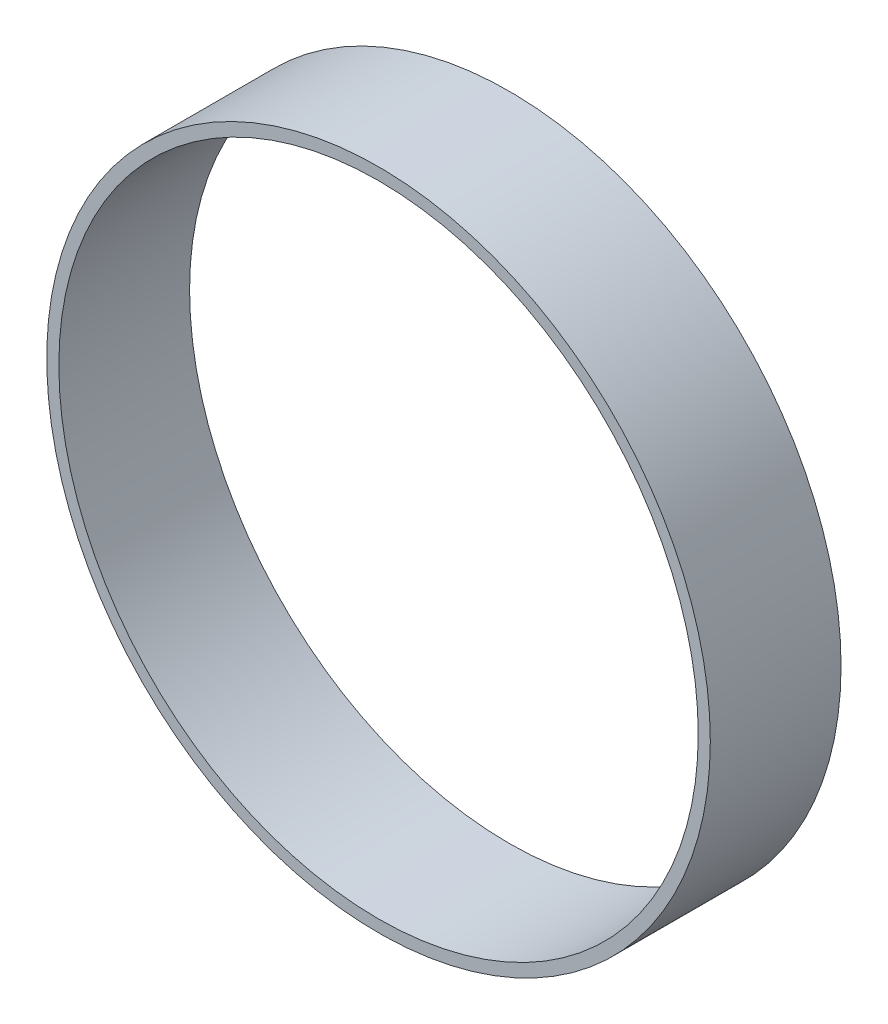
ISO-10303-21;
HEADER;
FILE_DESCRIPTION(('STEP AP214'),'2;1');
FILE_NAME('part.step','',(''),(''),'','','');
FILE_SCHEMA(('AUTOMOTIVE_DESIGN { 1 0 10303 214 1 1 1 1 }'));
ENDSEC;
DATA;
#1=APPLICATION_CONTEXT('core data for automotive mechanical design processes');
#2=APPLICATION_PROTOCOL_DEFINITION('international standard','automotive_design',2000,#1);
#3=PRODUCT_CONTEXT('',#1,'mechanical');
#4=PRODUCT('Part','Part','',(#3));
#5=PRODUCT_RELATED_PRODUCT_CATEGORY('part','',(#4));
#6=PRODUCT_DEFINITION_FORMATION('','',#4);
#7=PRODUCT_DEFINITION_CONTEXT('part definition',#1,'design');
#8=PRODUCT_DEFINITION('design','',#6,#7);
#9=PRODUCT_DEFINITION_SHAPE('','',#8);
#10=(LENGTH_UNIT() NAMED_UNIT(*) SI_UNIT(.MILLI.,.METRE.));
#11=(NAMED_UNIT(*) PLANE_ANGLE_UNIT() SI_UNIT($,.RADIAN.));
#12=(NAMED_UNIT(*) SI_UNIT($,.STERADIAN.) SOLID_ANGLE_UNIT());
#13=UNCERTAINTY_MEASURE_WITH_UNIT(LENGTH_MEASURE(1.E-05),#10,'distance_accuracy_value','');
#14=(GEOMETRIC_REPRESENTATION_CONTEXT(3) GLOBAL_UNCERTAINTY_ASSIGNED_CONTEXT((#13)) GLOBAL_UNIT_ASSIGNED_CONTEXT((#10,
#11,#12)) REPRESENTATION_CONTEXT('',''));
#15=CARTESIAN_POINT('',(0.,0.,0.));
#16=DIRECTION('',(0.,0.,1.));
#17=DIRECTION('',(1.,0.,0.));
#18=AXIS2_PLACEMENT_3D('',#15,#16,#17);
#19=CARTESIAN_POINT('',(0.,0.,5.3));
#20=DIRECTION('',(0.,0.,1.));
#21=DIRECTION('',(1.,0.,0.));
#22=AXIS2_PLACEMENT_3D('',#19,#20,#21);
#23=PLANE('',#22);
#24=CARTESIAN_POINT('',(0.,0.,5.3));
#25=DIRECTION('',(0.,0.,1.));
#26=DIRECTION('',(1.,0.,0.));
#27=AXIS2_PLACEMENT_3D('',#24,#25,#26);
#28=CIRCLE('',#27,13.45);
#29=CARTESIAN_POINT('',(13.45,0.,5.3));
#30=VERTEX_POINT('',#29);
#31=EDGE_CURVE('E11',#30,#30,#28,.T.);
#32=ORIENTED_EDGE('',*,*,#31,.T.);
#33=EDGE_LOOP('',(#32));
#34=FACE_BOUND('',#33,.T.);
#35=CARTESIAN_POINT('',(0.,0.,5.3));
#36=DIRECTION('',(0.,0.,1.));
#37=DIRECTION('',(1.,0.,0.));
#38=AXIS2_PLACEMENT_3D('',#35,#36,#37);
#39=CIRCLE('',#38,12.96);
#40=CARTESIAN_POINT('',(12.96,0.,5.3));
#41=VERTEX_POINT('',#40);
#42=EDGE_CURVE('E56',#41,#41,#39,.T.);
#43=ORIENTED_EDGE('',*,*,#42,.F.);
#44=EDGE_LOOP('',(#43));
#45=FACE_BOUND('',#44,.T.);
#46=ADVANCED_FACE('F43',(#34,#45),#23,.T.);
#47=CARTESIAN_POINT('',(0.,0.,0.));
#48=DIRECTION('',(0.,0.,1.));
#49=DIRECTION('',(1.,0.,0.));
#50=AXIS2_PLACEMENT_3D('',#47,#48,#49);
#51=PLANE('',#50);
#52=CARTESIAN_POINT('',(0.,0.,0.));
#53=DIRECTION('',(0.,0.,1.));
#54=DIRECTION('',(1.,0.,0.));
#55=AXIS2_PLACEMENT_3D('',#52,#53,#54);
#56=CIRCLE('',#55,13.45);
#57=CARTESIAN_POINT('',(13.45,0.,0.));
#58=VERTEX_POINT('',#57);
#59=EDGE_CURVE('E47',#58,#58,#56,.T.);
#60=ORIENTED_EDGE('',*,*,#59,.F.);
#61=EDGE_LOOP('',(#60));
#62=FACE_BOUND('',#61,.T.);
#63=CARTESIAN_POINT('',(0.,0.,0.));
#64=DIRECTION('',(0.,0.,1.));
#65=DIRECTION('',(1.,0.,0.));
#66=AXIS2_PLACEMENT_3D('',#63,#64,#65);
#67=CIRCLE('',#66,12.96);
#68=CARTESIAN_POINT('',(12.96,0.,0.));
#69=VERTEX_POINT('',#68);
#70=EDGE_CURVE('E58',#69,#69,#67,.T.);
#71=ORIENTED_EDGE('',*,*,#70,.T.);
#72=EDGE_LOOP('',(#71));
#73=FACE_BOUND('',#72,.T.);
#74=ADVANCED_FACE('F70',(#62,#73),#51,.F.);
#75=CARTESIAN_POINT('',(0.,0.,5.3));
#76=DIRECTION('',(0.,0.,-1.));
#77=DIRECTION('',(-1.,0.,0.));
#78=AXIS2_PLACEMENT_3D('',#75,#76,#77);
#79=CYLINDRICAL_SURFACE('',#78,13.45);
#80=ORIENTED_EDGE('',*,*,#31,.F.);
#81=EDGE_LOOP('',(#80));
#82=FACE_BOUND('',#81,.T.);
#83=ORIENTED_EDGE('',*,*,#59,.T.);
#84=EDGE_LOOP('',(#83));
#85=FACE_BOUND('',#84,.T.);
#86=ADVANCED_FACE('F45',(#82,#85),#79,.T.);
#87=CARTESIAN_POINT('',(0.,0.,5.3));
#88=DIRECTION('',(0.,0.,-1.));
#89=DIRECTION('',(-1.,0.,0.));
#90=AXIS2_PLACEMENT_3D('',#87,#88,#89);
#91=CYLINDRICAL_SURFACE('',#90,12.96);
#92=ORIENTED_EDGE('',*,*,#42,.T.);
#93=EDGE_LOOP('',(#92));
#94=FACE_BOUND('',#93,.T.);
#95=ORIENTED_EDGE('',*,*,#70,.F.);
#96=EDGE_LOOP('',(#95));
#97=FACE_BOUND('',#96,.T.);
#98=ADVANCED_FACE('F66',(#94,#97),#91,.F.);
#99=CLOSED_SHELL('',(#46,#74,#86,#98));
#100=MANIFOLD_SOLID_BREP('B2',#99);
#101=ADVANCED_BREP_SHAPE_REPRESENTATION('',(#18,#100),#14);
#102=SHAPE_DEFINITION_REPRESENTATION(#9,#101);
ENDSEC;
END-ISO-10303-21;
